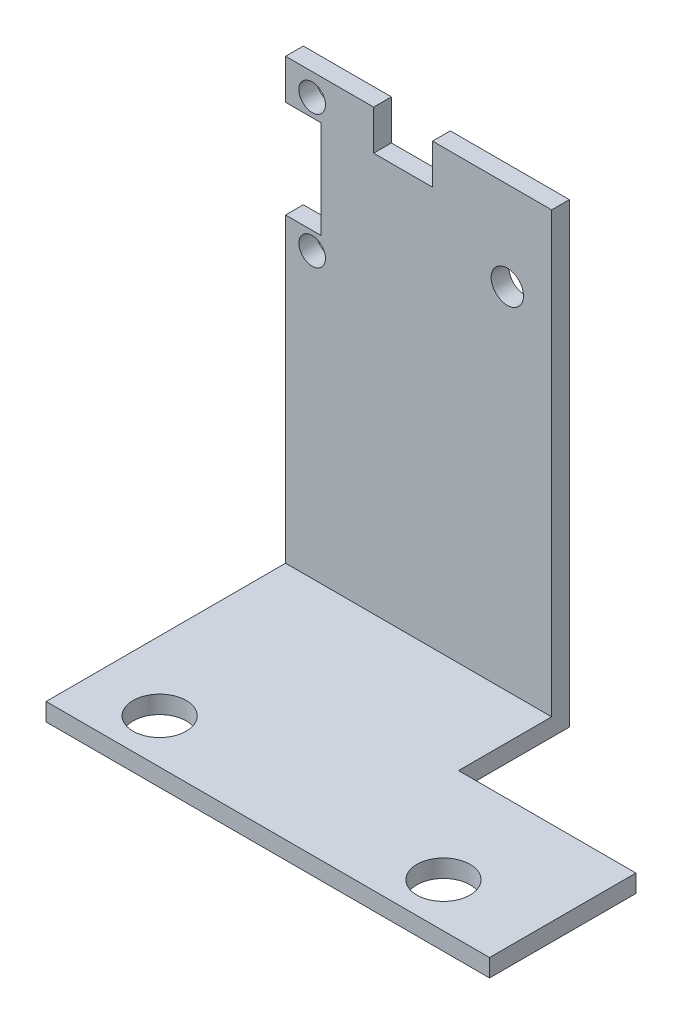
ISO-10303-21;
HEADER;
FILE_DESCRIPTION(('STEP AP214'),'2;1');
FILE_NAME('part.step','',(''),(''),'','','');
FILE_SCHEMA(('AUTOMOTIVE_DESIGN { 1 0 10303 214 1 1 1 1 }'));
ENDSEC;
DATA;
#1=APPLICATION_CONTEXT('core data for automotive mechanical design processes');
#2=APPLICATION_PROTOCOL_DEFINITION('international standard','automotive_design',2000,#1);
#3=PRODUCT_CONTEXT('',#1,'mechanical');
#4=PRODUCT('Part','Part','',(#3));
#5=PRODUCT_RELATED_PRODUCT_CATEGORY('part','',(#4));
#6=PRODUCT_DEFINITION_FORMATION('','',#4);
#7=PRODUCT_DEFINITION_CONTEXT('part definition',#1,'design');
#8=PRODUCT_DEFINITION('design','',#6,#7);
#9=PRODUCT_DEFINITION_SHAPE('','',#8);
#10=(LENGTH_UNIT() NAMED_UNIT(*) SI_UNIT(.MILLI.,.METRE.));
#11=(NAMED_UNIT(*) PLANE_ANGLE_UNIT() SI_UNIT($,.RADIAN.));
#12=(NAMED_UNIT(*) SI_UNIT($,.STERADIAN.) SOLID_ANGLE_UNIT());
#13=UNCERTAINTY_MEASURE_WITH_UNIT(LENGTH_MEASURE(1.E-05),#10,'distance_accuracy_value','');
#14=(GEOMETRIC_REPRESENTATION_CONTEXT(3) GLOBAL_UNCERTAINTY_ASSIGNED_CONTEXT((#13)) GLOBAL_UNIT_ASSIGNED_CONTEXT((#10,
#11,#12)) REPRESENTATION_CONTEXT('',''));
#15=CARTESIAN_POINT('',(0.,0.,0.));
#16=DIRECTION('',(0.,0.,1.));
#17=DIRECTION('',(1.,0.,0.));
#18=AXIS2_PLACEMENT_3D('',#15,#16,#17);
#19=CARTESIAN_POINT('',(-25.,2.,14.5));
#20=DIRECTION('',(1.,0.,0.));
#21=DIRECTION('',(0.,0.,-1.));
#22=AXIS2_PLACEMENT_3D('',#19,#20,#21);
#23=PLANE('',#22);
#24=DIRECTION('',(0.,-1.,0.));
#25=VECTOR('',#24,1.);
#26=CARTESIAN_POINT('',(-25.,2.,-14.5));
#27=LINE('',#26,#25);
#28=CARTESIAN_POINT('',(-25.,51.5,-14.5));
#29=VERTEX_POINT('',#28);
#30=CARTESIAN_POINT('',(-25.,47.,-14.5));
#31=VERTEX_POINT('',#30);
#32=EDGE_CURVE('E353',#29,#31,#27,.T.);
#33=ORIENTED_EDGE('',*,*,#32,.T.);
#34=DIRECTION('',(0.,0.,1.));
#35=VECTOR('',#34,1.);
#36=CARTESIAN_POINT('',(-25.,47.,-62.));
#37=LINE('',#36,#35);
#38=CARTESIAN_POINT('',(-25.,47.,-12.5));
#39=VERTEX_POINT('',#38);
#40=EDGE_CURVE('E203',#31,#39,#37,.T.);
#41=ORIENTED_EDGE('',*,*,#40,.T.);
#42=DIRECTION('',(0.,-1.,0.));
#43=VECTOR('',#42,1.);
#44=CARTESIAN_POINT('',(-25.,51.5,-12.5));
#45=LINE('',#44,#43);
#46=CARTESIAN_POINT('',(-25.,51.5,-12.5));
#47=VERTEX_POINT('',#46);
#48=EDGE_CURVE('E303',#47,#39,#45,.T.);
#49=ORIENTED_EDGE('',*,*,#48,.F.);
#50=DIRECTION('',(0.,0.,1.));
#51=VECTOR('',#50,1.);
#52=CARTESIAN_POINT('',(-25.,51.5,-14.5));
#53=LINE('',#52,#51);
#54=EDGE_CURVE('E278',#29,#47,#53,.T.);
#55=ORIENTED_EDGE('',*,*,#54,.F.);
#56=EDGE_LOOP('',(#33,#41,#49,#55));
#57=FACE_BOUND('',#56,.T.);
#58=ADVANCED_FACE('F39',(#57),#23,.F.);
#59=CARTESIAN_POINT('',(0.,51.5,0.));
#60=DIRECTION('',(0.,1.,0.));
#61=DIRECTION('',(0.,0.,1.));
#62=AXIS2_PLACEMENT_3D('',#59,#60,#61);
#63=PLANE('',#62);
#64=DIRECTION('',(0.,0.,1.));
#65=VECTOR('',#64,1.);
#66=CARTESIAN_POINT('',(-15.0685863304534,51.5,0.));
#67=LINE('',#66,#65);
#68=CARTESIAN_POINT('',(-15.0685863304534,51.5,-14.5));
#69=VERTEX_POINT('',#68);
#70=CARTESIAN_POINT('',(-15.0685863304534,51.5,-12.5));
#71=VERTEX_POINT('',#70);
#72=EDGE_CURVE('E11',#69,#71,#67,.T.);
#73=ORIENTED_EDGE('',*,*,#72,.F.);
#74=DIRECTION('',(-1.,0.,0.));
#75=VECTOR('',#74,1.);
#76=CARTESIAN_POINT('',(-25.,51.5,-14.5));
#77=LINE('',#76,#75);
#78=EDGE_CURVE('E290',#69,#29,#77,.T.);
#79=ORIENTED_EDGE('',*,*,#78,.T.);
#80=ORIENTED_EDGE('',*,*,#54,.T.);
#81=DIRECTION('',(1.,0.,0.));
#82=VECTOR('',#81,1.);
#83=CARTESIAN_POINT('',(-25.,51.5,-12.5));
#84=LINE('',#83,#82);
#85=EDGE_CURVE('E283',#47,#71,#84,.T.);
#86=ORIENTED_EDGE('',*,*,#85,.T.);
#87=EDGE_LOOP('',(#73,#79,#80,#86));
#88=FACE_BOUND('',#87,.T.);
#89=ADVANCED_FACE('F394',(#88),#63,.T.);
#90=CARTESIAN_POINT('',(0.,2.,0.));
#91=DIRECTION('',(0.,-1.,0.));
#92=DIRECTION('',(0.,0.,-1.));
#93=AXIS2_PLACEMENT_3D('',#90,#91,#92);
#94=PLANE('',#93);
#95=CARTESIAN_POINT('',(-17.1976066547046,2.,9.5));
#96=DIRECTION('',(0.,1.,0.));
#97=DIRECTION('',(0.,0.,1.));
#98=AXIS2_PLACEMENT_3D('',#95,#96,#97);
#99=CIRCLE('',#98,3.);
#100=CARTESIAN_POINT('',(-17.1976066547046,2.,12.5));
#101=VERTEX_POINT('',#100);
#102=EDGE_CURVE('E308',#101,#101,#99,.T.);
#103=ORIENTED_EDGE('',*,*,#102,.F.);
#104=EDGE_LOOP('',(#103));
#105=FACE_BOUND('',#104,.T.);
#106=CARTESIAN_POINT('',(14.8023933452954,2.,9.5));
#107=DIRECTION('',(0.,1.,0.));
#108=DIRECTION('',(0.,0.,1.));
#109=AXIS2_PLACEMENT_3D('',#106,#107,#108);
#110=CIRCLE('',#109,3.);
#111=CARTESIAN_POINT('',(14.8023933452954,2.,12.5));
#112=VERTEX_POINT('',#111);
#113=EDGE_CURVE('E316',#112,#112,#110,.T.);
#114=ORIENTED_EDGE('',*,*,#113,.F.);
#115=EDGE_LOOP('',(#114));
#116=FACE_BOUND('',#115,.T.);
#117=DIRECTION('',(0.,0.,-1.));
#118=VECTOR('',#117,1.);
#119=CARTESIAN_POINT('',(25.,2.,14.5));
#120=LINE('',#119,#118);
#121=CARTESIAN_POINT('',(25.,2.,14.5));
#122=VERTEX_POINT('',#121);
#123=CARTESIAN_POINT('',(25.,2.,-2.));
#124=VERTEX_POINT('',#123);
#125=EDGE_CURVE('E180',#122,#124,#120,.T.);
#126=ORIENTED_EDGE('',*,*,#125,.T.);
#127=DIRECTION('',(1.,0.,0.));
#128=VECTOR('',#127,1.);
#129=CARTESIAN_POINT('',(25.,2.,-2.));
#130=LINE('',#129,#128);
#131=CARTESIAN_POINT('',(5.,2.,-2.));
#132=VERTEX_POINT('',#131);
#133=EDGE_CURVE('E156',#132,#124,#130,.T.);
#134=ORIENTED_EDGE('',*,*,#133,.F.);
#135=DIRECTION('',(0.,0.,1.));
#136=VECTOR('',#135,1.);
#137=CARTESIAN_POINT('',(5.,2.,-14.5));
#138=LINE('',#137,#136);
#139=CARTESIAN_POINT('',(5.,2.,-12.5));
#140=VERTEX_POINT('',#139);
#141=EDGE_CURVE('E167',#140,#132,#138,.T.);
#142=ORIENTED_EDGE('',*,*,#141,.F.);
#143=DIRECTION('',(1.,0.,0.));
#144=VECTOR('',#143,1.);
#145=CARTESIAN_POINT('',(-25.,2.,-12.5));
#146=LINE('',#145,#144);
#147=CARTESIAN_POINT('',(-25.,2.,-12.5));
#148=VERTEX_POINT('',#147);
#149=EDGE_CURVE('E277',#148,#140,#146,.T.);
#150=ORIENTED_EDGE('',*,*,#149,.F.);
#151=DIRECTION('',(0.,0.,1.));
#152=VECTOR('',#151,1.);
#153=CARTESIAN_POINT('',(-25.,2.,14.5));
#154=LINE('',#153,#152);
#155=CARTESIAN_POINT('',(-25.,2.,14.5));
#156=VERTEX_POINT('',#155);
#157=EDGE_CURVE('E326',#148,#156,#154,.T.);
#158=ORIENTED_EDGE('',*,*,#157,.T.);
#159=DIRECTION('',(1.,0.,0.));
#160=VECTOR('',#159,1.);
#161=CARTESIAN_POINT('',(-25.,2.,14.5));
#162=LINE('',#161,#160);
#163=EDGE_CURVE('E330',#156,#122,#162,.T.);
#164=ORIENTED_EDGE('',*,*,#163,.T.);
#165=EDGE_LOOP('',(#126,#134,#142,#150,#158,#164));
#166=FACE_BOUND('',#165,.T.);
#167=ADVANCED_FACE('F178',(#105,#116,#166),#94,.F.);
#168=CARTESIAN_POINT('',(0.,0.,0.));
#169=DIRECTION('',(0.,-1.,0.));
#170=DIRECTION('',(0.,0.,-1.));
#171=AXIS2_PLACEMENT_3D('',#168,#169,#170);
#172=PLANE('',#171);
#173=DIRECTION('',(-1.,0.,0.));
#174=VECTOR('',#173,1.);
#175=CARTESIAN_POINT('',(0.,0.,-2.));
#176=LINE('',#175,#174);
#177=CARTESIAN_POINT('',(25.,0.,-2.));
#178=VERTEX_POINT('',#177);
#179=CARTESIAN_POINT('',(5.,0.,-2.));
#180=VERTEX_POINT('',#179);
#181=EDGE_CURVE('E159',#178,#180,#176,.T.);
#182=ORIENTED_EDGE('',*,*,#181,.F.);
#183=DIRECTION('',(0.,0.,-1.));
#184=VECTOR('',#183,1.);
#185=CARTESIAN_POINT('',(25.,0.,14.5));
#186=LINE('',#185,#184);
#187=CARTESIAN_POINT('',(25.,0.,14.5));
#188=VERTEX_POINT('',#187);
#189=EDGE_CURVE('E320',#188,#178,#186,.T.);
#190=ORIENTED_EDGE('',*,*,#189,.F.);
#191=DIRECTION('',(1.,0.,0.));
#192=VECTOR('',#191,1.);
#193=CARTESIAN_POINT('',(-25.,0.,14.5));
#194=LINE('',#193,#192);
#195=CARTESIAN_POINT('',(-25.,0.,14.5));
#196=VERTEX_POINT('',#195);
#197=EDGE_CURVE('E327',#196,#188,#194,.T.);
#198=ORIENTED_EDGE('',*,*,#197,.F.);
#199=DIRECTION('',(0.,0.,1.));
#200=VECTOR('',#199,1.);
#201=CARTESIAN_POINT('',(-25.,0.,14.5));
#202=LINE('',#201,#200);
#203=CARTESIAN_POINT('',(-25.,0.,-14.5));
#204=VERTEX_POINT('',#203);
#205=EDGE_CURVE('E340',#204,#196,#202,.T.);
#206=ORIENTED_EDGE('',*,*,#205,.F.);
#207=DIRECTION('',(-1.,0.,0.));
#208=VECTOR('',#207,1.);
#209=CARTESIAN_POINT('',(-25.,0.,-14.5));
#210=LINE('',#209,#208);
#211=CARTESIAN_POINT('',(5.,0.,-14.5));
#212=VERTEX_POINT('',#211);
#213=EDGE_CURVE('E337',#212,#204,#210,.T.);
#214=ORIENTED_EDGE('',*,*,#213,.F.);
#215=DIRECTION('',(0.,0.,-1.));
#216=VECTOR('',#215,1.);
#217=CARTESIAN_POINT('',(5.,0.,0.));
#218=LINE('',#217,#216);
#219=EDGE_CURVE('E185',#180,#212,#218,.T.);
#220=ORIENTED_EDGE('',*,*,#219,.F.);
#221=EDGE_LOOP('',(#182,#190,#198,#206,#214,#220));
#222=FACE_BOUND('',#221,.T.);
#223=CARTESIAN_POINT('',(14.8023933452954,0.,9.5));
#224=DIRECTION('',(0.,1.,0.));
#225=DIRECTION('',(0.,0.,1.));
#226=AXIS2_PLACEMENT_3D('',#223,#224,#225);
#227=CIRCLE('',#226,3.);
#228=CARTESIAN_POINT('',(14.8023933452954,0.,12.5));
#229=VERTEX_POINT('',#228);
#230=EDGE_CURVE('E312',#229,#229,#227,.T.);
#231=ORIENTED_EDGE('',*,*,#230,.T.);
#232=EDGE_LOOP('',(#231));
#233=FACE_BOUND('',#232,.T.);
#234=CARTESIAN_POINT('',(-17.1976066547046,0.,9.5));
#235=DIRECTION('',(0.,1.,0.));
#236=DIRECTION('',(0.,0.,1.));
#237=AXIS2_PLACEMENT_3D('',#234,#235,#236);
#238=CIRCLE('',#237,3.);
#239=CARTESIAN_POINT('',(-17.1976066547046,0.,12.5));
#240=VERTEX_POINT('',#239);
#241=EDGE_CURVE('E307',#240,#240,#238,.T.);
#242=ORIENTED_EDGE('',*,*,#241,.T.);
#243=EDGE_LOOP('',(#242));
#244=FACE_BOUND('',#243,.T.);
#245=ADVANCED_FACE('F378',(#222,#233,#244),#172,.T.);
#246=CARTESIAN_POINT('',(25.,2.,14.5));
#247=DIRECTION('',(-1.,0.,0.));
#248=DIRECTION('',(0.,0.,1.));
#249=AXIS2_PLACEMENT_3D('',#246,#247,#248);
#250=PLANE('',#249);
#251=ORIENTED_EDGE('',*,*,#189,.T.);
#252=DIRECTION('',(0.,1.,0.));
#253=VECTOR('',#252,1.);
#254=CARTESIAN_POINT('',(25.,-47.5,-2.));
#255=LINE('',#254,#253);
#256=EDGE_CURVE('E164',#178,#124,#255,.T.);
#257=ORIENTED_EDGE('',*,*,#256,.T.);
#258=ORIENTED_EDGE('',*,*,#125,.F.);
#259=DIRECTION('',(0.,-1.,0.));
#260=VECTOR('',#259,1.);
#261=CARTESIAN_POINT('',(25.,2.,14.5));
#262=LINE('',#261,#260);
#263=EDGE_CURVE('E333',#122,#188,#262,.T.);
#264=ORIENTED_EDGE('',*,*,#263,.T.);
#265=EDGE_LOOP('',(#251,#257,#258,#264));
#266=FACE_BOUND('',#265,.T.);
#267=ADVANCED_FACE('F41',(#266),#250,.F.);
#268=CARTESIAN_POINT('',(-25.,2.,-14.5));
#269=DIRECTION('',(0.,0.,1.));
#270=DIRECTION('',(1.,0.,0.));
#271=AXIS2_PLACEMENT_3D('',#268,#269,#270);
#272=PLANE('',#271);
#273=CARTESIAN_POINT('',(-22.,34.,-14.5));
#274=DIRECTION('',(0.,0.,1.));
#275=DIRECTION('',(1.,0.,0.));
#276=AXIS2_PLACEMENT_3D('',#273,#274,#275);
#277=CIRCLE('',#276,1.5);
#278=CARTESIAN_POINT('',(-20.5,34.,-14.5));
#279=VERTEX_POINT('',#278);
#280=EDGE_CURVE('E273',#279,#279,#277,.T.);
#281=ORIENTED_EDGE('',*,*,#280,.T.);
#282=EDGE_LOOP('',(#281));
#283=FACE_BOUND('',#282,.T.);
#284=CARTESIAN_POINT('',(0.,41.5,-14.5));
#285=DIRECTION('',(0.,0.,1.));
#286=DIRECTION('',(1.,0.,0.));
#287=AXIS2_PLACEMENT_3D('',#284,#285,#286);
#288=CIRCLE('',#287,1.82255039849977);
#289=CARTESIAN_POINT('',(1.82255039849977,41.5,-14.5));
#290=VERTEX_POINT('',#289);
#291=EDGE_CURVE('E269',#290,#290,#288,.T.);
#292=ORIENTED_EDGE('',*,*,#291,.T.);
#293=EDGE_LOOP('',(#292));
#294=FACE_BOUND('',#293,.T.);
#295=DIRECTION('',(0.,-1.,0.));
#296=VECTOR('',#295,1.);
#297=CARTESIAN_POINT('',(5.,51.5,-14.5));
#298=LINE('',#297,#296);
#299=CARTESIAN_POINT('',(5.,51.5,-14.5));
#300=VERTEX_POINT('',#299);
#301=EDGE_CURVE('E295',#300,#212,#298,.T.);
#302=ORIENTED_EDGE('',*,*,#301,.T.);
#303=ORIENTED_EDGE('',*,*,#213,.T.);
#304=CARTESIAN_POINT('',(-25.,36.,-14.5));
#305=VERTEX_POINT('',#304);
#306=EDGE_CURVE('E352',#305,#204,#27,.T.);
#307=ORIENTED_EDGE('',*,*,#306,.F.);
#308=DIRECTION('',(1.,0.,0.));
#309=VECTOR('',#308,1.);
#310=CARTESIAN_POINT('',(-25.,36.,-14.5));
#311=LINE('',#310,#309);
#312=CARTESIAN_POINT('',(-21.,36.,-14.5));
#313=VERTEX_POINT('',#312);
#314=EDGE_CURVE('E257',#305,#313,#311,.T.);
#315=ORIENTED_EDGE('',*,*,#314,.T.);
#316=DIRECTION('',(0.,1.,0.));
#317=VECTOR('',#316,1.);
#318=CARTESIAN_POINT('',(-21.,2.,-14.5));
#319=LINE('',#318,#317);
#320=CARTESIAN_POINT('',(-21.,47.,-14.5));
#321=VERTEX_POINT('',#320);
#322=EDGE_CURVE('E261',#313,#321,#319,.T.);
#323=ORIENTED_EDGE('',*,*,#322,.T.);
#324=DIRECTION('',(-1.,0.,0.));
#325=VECTOR('',#324,1.);
#326=CARTESIAN_POINT('',(-25.,47.,-14.5));
#327=LINE('',#326,#325);
#328=EDGE_CURVE('E265',#321,#31,#327,.T.);
#329=ORIENTED_EDGE('',*,*,#328,.T.);
#330=ORIENTED_EDGE('',*,*,#32,.F.);
#331=ORIENTED_EDGE('',*,*,#78,.F.);
#332=DIRECTION('',(0.,-1.,0.));
#333=VECTOR('',#332,1.);
#334=CARTESIAN_POINT('',(-15.0685863304534,2.,-14.5));
#335=LINE('',#334,#333);
#336=CARTESIAN_POINT('',(-15.0685863304534,47.,-14.5));
#337=VERTEX_POINT('',#336);
#338=EDGE_CURVE('E245',#69,#337,#335,.T.);
#339=ORIENTED_EDGE('',*,*,#338,.T.);
#340=DIRECTION('',(1.,0.,0.));
#341=VECTOR('',#340,1.);
#342=CARTESIAN_POINT('',(-25.,47.,-14.5));
#343=LINE('',#342,#341);
#344=CARTESIAN_POINT('',(-8.42929559306142,47.,-14.5));
#345=VERTEX_POINT('',#344);
#346=EDGE_CURVE('E253',#337,#345,#343,.T.);
#347=ORIENTED_EDGE('',*,*,#346,.T.);
#348=DIRECTION('',(0.,1.,0.));
#349=VECTOR('',#348,1.);
#350=CARTESIAN_POINT('',(-8.42929559306142,2.,-14.5));
#351=LINE('',#350,#349);
#352=CARTESIAN_POINT('',(-8.42929559306142,51.5,-14.5));
#353=VERTEX_POINT('',#352);
#354=EDGE_CURVE('E241',#345,#353,#351,.T.);
#355=ORIENTED_EDGE('',*,*,#354,.T.);
#356=EDGE_CURVE('E291',#300,#353,#77,.T.);
#357=ORIENTED_EDGE('',*,*,#356,.F.);
#358=EDGE_LOOP('',(#302,#303,#307,#315,#323,#329,#330,#331,#339,#347,#355,#357));
#359=FACE_BOUND('',#358,.T.);
#360=CARTESIAN_POINT('',(-22.,49.,-14.5));
#361=DIRECTION('',(0.,0.,1.));
#362=DIRECTION('',(1.,0.,0.));
#363=AXIS2_PLACEMENT_3D('',#360,#361,#362);
#364=CIRCLE('',#363,1.5);
#365=CARTESIAN_POINT('',(-20.5,49.,-14.5));
#366=VERTEX_POINT('',#365);
#367=EDGE_CURVE('E249',#366,#366,#364,.T.);
#368=ORIENTED_EDGE('',*,*,#367,.T.);
#369=EDGE_LOOP('',(#368));
#370=FACE_BOUND('',#369,.T.);
#371=ADVANCED_FACE('F363',(#283,#294,#359,#370),#272,.F.);
#372=CARTESIAN_POINT('',(-25.,36.,-12.5));
#373=VERTEX_POINT('',#372);
#374=EDGE_CURVE('E302',#373,#148,#45,.T.);
#375=ORIENTED_EDGE('',*,*,#374,.F.);
#376=DIRECTION('',(0.,0.,1.));
#377=VECTOR('',#376,1.);
#378=CARTESIAN_POINT('',(-25.,36.,-62.));
#379=LINE('',#378,#377);
#380=EDGE_CURVE('E55',#305,#373,#379,.T.);
#381=ORIENTED_EDGE('',*,*,#380,.F.);
#382=ORIENTED_EDGE('',*,*,#306,.T.);
#383=ORIENTED_EDGE('',*,*,#205,.T.);
#384=DIRECTION('',(0.,-1.,0.));
#385=VECTOR('',#384,1.);
#386=CARTESIAN_POINT('',(-25.,2.,14.5));
#387=LINE('',#386,#385);
#388=EDGE_CURVE('E348',#156,#196,#387,.T.);
#389=ORIENTED_EDGE('',*,*,#388,.F.);
#390=ORIENTED_EDGE('',*,*,#157,.F.);
#391=EDGE_LOOP('',(#375,#381,#382,#383,#389,#390));
#392=FACE_BOUND('',#391,.T.);
#393=ADVANCED_FACE('F374',(#392),#23,.F.);
#394=CARTESIAN_POINT('',(-25.,2.,14.5));
#395=DIRECTION('',(0.,0.,-1.));
#396=DIRECTION('',(-1.,0.,0.));
#397=AXIS2_PLACEMENT_3D('',#394,#395,#396);
#398=PLANE('',#397);
#399=ORIENTED_EDGE('',*,*,#197,.T.);
#400=ORIENTED_EDGE('',*,*,#263,.F.);
#401=ORIENTED_EDGE('',*,*,#163,.F.);
#402=ORIENTED_EDGE('',*,*,#388,.T.);
#403=EDGE_LOOP('',(#399,#400,#401,#402));
#404=FACE_BOUND('',#403,.T.);
#405=ADVANCED_FACE('F383',(#404),#398,.F.);
#406=CARTESIAN_POINT('',(14.8023933452954,2.,9.5));
#407=DIRECTION('',(0.,-1.,0.));
#408=DIRECTION('',(0.,0.,-1.));
#409=AXIS2_PLACEMENT_3D('',#406,#407,#408);
#410=CYLINDRICAL_SURFACE('',#409,3.);
#411=ORIENTED_EDGE('',*,*,#113,.T.);
#412=EDGE_LOOP('',(#411));
#413=FACE_BOUND('',#412,.T.);
#414=ORIENTED_EDGE('',*,*,#230,.F.);
#415=EDGE_LOOP('',(#414));
#416=FACE_BOUND('',#415,.T.);
#417=ADVANCED_FACE('F407',(#413,#416),#410,.F.);
#418=CARTESIAN_POINT('',(-17.1976066547046,2.,9.5));
#419=DIRECTION('',(0.,-1.,0.));
#420=DIRECTION('',(0.,0.,-1.));
#421=AXIS2_PLACEMENT_3D('',#418,#419,#420);
#422=CYLINDRICAL_SURFACE('',#421,3.);
#423=ORIENTED_EDGE('',*,*,#102,.T.);
#424=EDGE_LOOP('',(#423));
#425=FACE_BOUND('',#424,.T.);
#426=ORIENTED_EDGE('',*,*,#241,.F.);
#427=EDGE_LOOP('',(#426));
#428=FACE_BOUND('',#427,.T.);
#429=ADVANCED_FACE('F411',(#425,#428),#422,.F.);
#430=CARTESIAN_POINT('',(-25.,51.5,-12.5));
#431=DIRECTION('',(0.,0.,-1.));
#432=DIRECTION('',(-1.,0.,0.));
#433=AXIS2_PLACEMENT_3D('',#430,#431,#432);
#434=PLANE('',#433);
#435=CARTESIAN_POINT('',(-22.,34.,-12.5));
#436=DIRECTION('',(0.,0.,1.));
#437=DIRECTION('',(1.,0.,0.));
#438=AXIS2_PLACEMENT_3D('',#435,#436,#437);
#439=CIRCLE('',#438,1.5);
#440=CARTESIAN_POINT('',(-20.5,34.,-12.5));
#441=VERTEX_POINT('',#440);
#442=EDGE_CURVE('E230',#441,#441,#439,.T.);
#443=ORIENTED_EDGE('',*,*,#442,.F.);
#444=EDGE_LOOP('',(#443));
#445=FACE_BOUND('',#444,.T.);
#446=CARTESIAN_POINT('',(0.,41.5,-12.5));
#447=DIRECTION('',(0.,0.,1.));
#448=DIRECTION('',(1.,0.,0.));
#449=AXIS2_PLACEMENT_3D('',#446,#447,#448);
#450=CIRCLE('',#449,1.82255039849977);
#451=CARTESIAN_POINT('',(1.82255039849977,41.5,-12.5));
#452=VERTEX_POINT('',#451);
#453=EDGE_CURVE('E207',#452,#452,#450,.T.);
#454=ORIENTED_EDGE('',*,*,#453,.F.);
#455=EDGE_LOOP('',(#454));
#456=FACE_BOUND('',#455,.T.);
#457=CARTESIAN_POINT('',(-22.,49.,-12.5));
#458=DIRECTION('',(0.,0.,1.));
#459=DIRECTION('',(1.,0.,0.));
#460=AXIS2_PLACEMENT_3D('',#457,#458,#459);
#461=CIRCLE('',#460,1.5);
#462=CARTESIAN_POINT('',(-20.5,49.,-12.5));
#463=VERTEX_POINT('',#462);
#464=EDGE_CURVE('E234',#463,#463,#461,.T.);
#465=ORIENTED_EDGE('',*,*,#464,.F.);
#466=EDGE_LOOP('',(#465));
#467=FACE_BOUND('',#466,.T.);
#468=ORIENTED_EDGE('',*,*,#48,.T.);
#469=DIRECTION('',(-1.,0.,0.));
#470=VECTOR('',#469,1.);
#471=CARTESIAN_POINT('',(-25.,47.,-12.5));
#472=LINE('',#471,#470);
#473=CARTESIAN_POINT('',(-21.,47.,-12.5));
#474=VERTEX_POINT('',#473);
#475=EDGE_CURVE('E200',#474,#39,#472,.T.);
#476=ORIENTED_EDGE('',*,*,#475,.F.);
#477=DIRECTION('',(0.,1.,0.));
#478=VECTOR('',#477,1.);
#479=CARTESIAN_POINT('',(-21.,47.,-12.5));
#480=LINE('',#479,#478);
#481=CARTESIAN_POINT('',(-21.,36.,-12.5));
#482=VERTEX_POINT('',#481);
#483=EDGE_CURVE('E195',#482,#474,#480,.T.);
#484=ORIENTED_EDGE('',*,*,#483,.F.);
#485=DIRECTION('',(1.,0.,0.));
#486=VECTOR('',#485,1.);
#487=CARTESIAN_POINT('',(-25.,36.,-12.5));
#488=LINE('',#487,#486);
#489=EDGE_CURVE('E192',#373,#482,#488,.T.);
#490=ORIENTED_EDGE('',*,*,#489,.F.);
#491=ORIENTED_EDGE('',*,*,#374,.T.);
#492=ORIENTED_EDGE('',*,*,#149,.T.);
#493=DIRECTION('',(0.,-1.,0.));
#494=VECTOR('',#493,1.);
#495=CARTESIAN_POINT('',(5.,51.5,-12.5));
#496=LINE('',#495,#494);
#497=CARTESIAN_POINT('',(5.,51.5,-12.5));
#498=VERTEX_POINT('',#497);
#499=EDGE_CURVE('E171',#498,#140,#496,.T.);
#500=ORIENTED_EDGE('',*,*,#499,.F.);
#501=CARTESIAN_POINT('',(-8.42929559306142,51.5,-12.5));
#502=VERTEX_POINT('',#501);
#503=EDGE_CURVE('E282',#502,#498,#84,.T.);
#504=ORIENTED_EDGE('',*,*,#503,.F.);
#505=DIRECTION('',(0.,1.,0.));
#506=VECTOR('',#505,1.);
#507=CARTESIAN_POINT('',(-8.42929559306142,51.5,-12.5));
#508=LINE('',#507,#506);
#509=CARTESIAN_POINT('',(-8.42929559306142,47.,-12.5));
#510=VERTEX_POINT('',#509);
#511=EDGE_CURVE('E63',#510,#502,#508,.T.);
#512=ORIENTED_EDGE('',*,*,#511,.F.);
#513=DIRECTION('',(1.,0.,0.));
#514=VECTOR('',#513,1.);
#515=CARTESIAN_POINT('',(-15.0685863304534,47.,-12.5));
#516=LINE('',#515,#514);
#517=CARTESIAN_POINT('',(-15.0685863304534,47.,-12.5));
#518=VERTEX_POINT('',#517);
#519=EDGE_CURVE('E219',#518,#510,#516,.T.);
#520=ORIENTED_EDGE('',*,*,#519,.F.);
#521=DIRECTION('',(0.,-1.,0.));
#522=VECTOR('',#521,1.);
#523=CARTESIAN_POINT('',(-15.0685863304534,51.5,-12.5));
#524=LINE('',#523,#522);
#525=EDGE_CURVE('E191',#71,#518,#524,.T.);
#526=ORIENTED_EDGE('',*,*,#525,.F.);
#527=ORIENTED_EDGE('',*,*,#85,.F.);
#528=EDGE_LOOP('',(#468,#476,#484,#490,#491,#492,#500,#504,#512,#520,#526,#527));
#529=FACE_BOUND('',#528,.T.);
#530=ADVANCED_FACE('F420',(#445,#456,#467,#529),#434,.F.);
#531=CARTESIAN_POINT('',(5.,51.5,-14.5));
#532=DIRECTION('',(-1.,0.,0.));
#533=DIRECTION('',(0.,0.,1.));
#534=AXIS2_PLACEMENT_3D('',#531,#532,#533);
#535=PLANE('',#534);
#536=ORIENTED_EDGE('',*,*,#499,.T.);
#537=ORIENTED_EDGE('',*,*,#141,.T.);
#538=DIRECTION('',(0.,1.,0.));
#539=VECTOR('',#538,1.);
#540=CARTESIAN_POINT('',(5.,-47.5,-2.));
#541=LINE('',#540,#539);
#542=EDGE_CURVE('E152',#180,#132,#541,.T.);
#543=ORIENTED_EDGE('',*,*,#542,.F.);
#544=ORIENTED_EDGE('',*,*,#219,.T.);
#545=ORIENTED_EDGE('',*,*,#301,.F.);
#546=DIRECTION('',(0.,0.,-1.));
#547=VECTOR('',#546,1.);
#548=CARTESIAN_POINT('',(5.,51.5,-14.5));
#549=LINE('',#548,#547);
#550=EDGE_CURVE('E287',#498,#300,#549,.T.);
#551=ORIENTED_EDGE('',*,*,#550,.F.);
#552=EDGE_LOOP('',(#536,#537,#543,#544,#545,#551));
#553=FACE_BOUND('',#552,.T.);
#554=ADVANCED_FACE('F168',(#553),#535,.F.);
#555=DIRECTION('',(0.,0.,-1.));
#556=VECTOR('',#555,1.);
#557=CARTESIAN_POINT('',(-8.42929559306142,51.5,0.));
#558=LINE('',#557,#556);
#559=EDGE_CURVE('E48',#502,#353,#558,.T.);
#560=ORIENTED_EDGE('',*,*,#559,.F.);
#561=ORIENTED_EDGE('',*,*,#503,.T.);
#562=ORIENTED_EDGE('',*,*,#550,.T.);
#563=ORIENTED_EDGE('',*,*,#356,.T.);
#564=EDGE_LOOP('',(#560,#561,#562,#563));
#565=FACE_BOUND('',#564,.T.);
#566=ADVANCED_FACE('F365',(#565),#63,.T.);
#567=CARTESIAN_POINT('',(-15.0685863304534,47.,-62.));
#568=DIRECTION('',(0.,-1.,0.));
#569=DIRECTION('',(0.,0.,-1.));
#570=AXIS2_PLACEMENT_3D('',#567,#568,#569);
#571=PLANE('',#570);
#572=DIRECTION('',(0.,0.,1.));
#573=VECTOR('',#572,1.);
#574=CARTESIAN_POINT('',(-15.0685863304534,47.,-62.));
#575=LINE('',#574,#573);
#576=EDGE_CURVE('E225',#337,#518,#575,.T.);
#577=ORIENTED_EDGE('',*,*,#576,.T.);
#578=ORIENTED_EDGE('',*,*,#519,.T.);
#579=DIRECTION('',(0.,0.,1.));
#580=VECTOR('',#579,1.);
#581=CARTESIAN_POINT('',(-8.42929559306142,47.,-62.));
#582=LINE('',#581,#580);
#583=EDGE_CURVE('E196',#345,#510,#582,.T.);
#584=ORIENTED_EDGE('',*,*,#583,.F.);
#585=ORIENTED_EDGE('',*,*,#346,.F.);
#586=EDGE_LOOP('',(#577,#578,#584,#585));
#587=FACE_BOUND('',#586,.T.);
#588=ADVANCED_FACE('F428',(#587),#571,.F.);
#589=CARTESIAN_POINT('',(-15.0685863304534,51.5,-62.));
#590=DIRECTION('',(-1.,0.,0.));
#591=DIRECTION('',(0.,0.,1.));
#592=AXIS2_PLACEMENT_3D('',#589,#590,#591);
#593=PLANE('',#592);
#594=ORIENTED_EDGE('',*,*,#72,.T.);
#595=ORIENTED_EDGE('',*,*,#525,.T.);
#596=ORIENTED_EDGE('',*,*,#576,.F.);
#597=ORIENTED_EDGE('',*,*,#338,.F.);
#598=EDGE_LOOP('',(#594,#595,#596,#597));
#599=FACE_BOUND('',#598,.T.);
#600=ADVANCED_FACE('F443',(#599),#593,.F.);
#601=CARTESIAN_POINT('',(-8.42929559306142,51.5,-62.));
#602=DIRECTION('',(1.,0.,0.));
#603=DIRECTION('',(0.,0.,-1.));
#604=AXIS2_PLACEMENT_3D('',#601,#602,#603);
#605=PLANE('',#604);
#606=ORIENTED_EDGE('',*,*,#583,.T.);
#607=ORIENTED_EDGE('',*,*,#511,.T.);
#608=ORIENTED_EDGE('',*,*,#559,.T.);
#609=ORIENTED_EDGE('',*,*,#354,.F.);
#610=EDGE_LOOP('',(#606,#607,#608,#609));
#611=FACE_BOUND('',#610,.T.);
#612=ADVANCED_FACE('F357',(#611),#605,.F.);
#613=CARTESIAN_POINT('',(-22.,49.,-62.));
#614=DIRECTION('',(0.,0.,1.));
#615=DIRECTION('',(1.,0.,0.));
#616=AXIS2_PLACEMENT_3D('',#613,#614,#615);
#617=CYLINDRICAL_SURFACE('',#616,1.5);
#618=ORIENTED_EDGE('',*,*,#464,.T.);
#619=EDGE_LOOP('',(#618));
#620=FACE_BOUND('',#619,.T.);
#621=ORIENTED_EDGE('',*,*,#367,.F.);
#622=EDGE_LOOP('',(#621));
#623=FACE_BOUND('',#622,.T.);
#624=ADVANCED_FACE('F429',(#620,#623),#617,.F.);
#625=CARTESIAN_POINT('',(-25.,47.,-62.));
#626=DIRECTION('',(0.,1.,0.));
#627=DIRECTION('',(0.,0.,1.));
#628=AXIS2_PLACEMENT_3D('',#625,#626,#627);
#629=PLANE('',#628);
#630=DIRECTION('',(0.,0.,1.));
#631=VECTOR('',#630,1.);
#632=CARTESIAN_POINT('',(-21.,47.,-62.));
#633=LINE('',#632,#631);
#634=EDGE_CURVE('E208',#321,#474,#633,.T.);
#635=ORIENTED_EDGE('',*,*,#634,.T.);
#636=ORIENTED_EDGE('',*,*,#475,.T.);
#637=ORIENTED_EDGE('',*,*,#40,.F.);
#638=ORIENTED_EDGE('',*,*,#328,.F.);
#639=EDGE_LOOP('',(#635,#636,#637,#638));
#640=FACE_BOUND('',#639,.T.);
#641=ADVANCED_FACE('F432',(#640),#629,.F.);
#642=CARTESIAN_POINT('',(-21.,47.,-62.));
#643=DIRECTION('',(1.,0.,0.));
#644=DIRECTION('',(0.,0.,-1.));
#645=AXIS2_PLACEMENT_3D('',#642,#643,#644);
#646=PLANE('',#645);
#647=DIRECTION('',(0.,0.,1.));
#648=VECTOR('',#647,1.);
#649=CARTESIAN_POINT('',(-21.,36.,-62.));
#650=LINE('',#649,#648);
#651=EDGE_CURVE('E211',#313,#482,#650,.T.);
#652=ORIENTED_EDGE('',*,*,#651,.T.);
#653=ORIENTED_EDGE('',*,*,#483,.T.);
#654=ORIENTED_EDGE('',*,*,#634,.F.);
#655=ORIENTED_EDGE('',*,*,#322,.F.);
#656=EDGE_LOOP('',(#652,#653,#654,#655));
#657=FACE_BOUND('',#656,.T.);
#658=ADVANCED_FACE('F454',(#657),#646,.F.);
#659=CARTESIAN_POINT('',(-25.,36.,-62.));
#660=DIRECTION('',(0.,-1.,0.));
#661=DIRECTION('',(0.,0.,-1.));
#662=AXIS2_PLACEMENT_3D('',#659,#660,#661);
#663=PLANE('',#662);
#664=ORIENTED_EDGE('',*,*,#380,.T.);
#665=ORIENTED_EDGE('',*,*,#489,.T.);
#666=ORIENTED_EDGE('',*,*,#651,.F.);
#667=ORIENTED_EDGE('',*,*,#314,.F.);
#668=EDGE_LOOP('',(#664,#665,#666,#667));
#669=FACE_BOUND('',#668,.T.);
#670=ADVANCED_FACE('F438',(#669),#663,.F.);
#671=CARTESIAN_POINT('',(0.,41.5,-62.));
#672=DIRECTION('',(0.,0.,1.));
#673=DIRECTION('',(1.,0.,0.));
#674=AXIS2_PLACEMENT_3D('',#671,#672,#673);
#675=CYLINDRICAL_SURFACE('',#674,1.82255039849977);
#676=ORIENTED_EDGE('',*,*,#453,.T.);
#677=EDGE_LOOP('',(#676));
#678=FACE_BOUND('',#677,.T.);
#679=ORIENTED_EDGE('',*,*,#291,.F.);
#680=EDGE_LOOP('',(#679));
#681=FACE_BOUND('',#680,.T.);
#682=ADVANCED_FACE('F434',(#678,#681),#675,.F.);
#683=CARTESIAN_POINT('',(-22.,34.,-62.));
#684=DIRECTION('',(0.,0.,1.));
#685=DIRECTION('',(1.,0.,0.));
#686=AXIS2_PLACEMENT_3D('',#683,#684,#685);
#687=CYLINDRICAL_SURFACE('',#686,1.5);
#688=ORIENTED_EDGE('',*,*,#442,.T.);
#689=EDGE_LOOP('',(#688));
#690=FACE_BOUND('',#689,.T.);
#691=ORIENTED_EDGE('',*,*,#280,.F.);
#692=EDGE_LOOP('',(#691));
#693=FACE_BOUND('',#692,.T.);
#694=ADVANCED_FACE('F437',(#690,#693),#687,.F.);
#695=CARTESIAN_POINT('',(25.,-47.5,-2.));
#696=DIRECTION('',(0.,0.,1.));
#697=DIRECTION('',(1.,0.,0.));
#698=AXIS2_PLACEMENT_3D('',#695,#696,#697);
#699=PLANE('',#698);
#700=ORIENTED_EDGE('',*,*,#181,.T.);
#701=ORIENTED_EDGE('',*,*,#542,.T.);
#702=ORIENTED_EDGE('',*,*,#133,.T.);
#703=ORIENTED_EDGE('',*,*,#256,.F.);
#704=EDGE_LOOP('',(#700,#701,#702,#703));
#705=FACE_BOUND('',#704,.T.);
#706=ADVANCED_FACE('F154',(#705),#699,.F.);
#707=CLOSED_SHELL('',(#58,#89,#167,#245,#267,#371,#393,#405,#417,#429,#530,#554,#566,#588,#600,
#612,#624,#641,#658,#670,#682,#694,#706));
#708=MANIFOLD_SOLID_BREP('B2',#707);
#709=ADVANCED_BREP_SHAPE_REPRESENTATION('',(#18,#708),#14);
#710=SHAPE_DEFINITION_REPRESENTATION(#9,#709);
ENDSEC;
END-ISO-10303-21;
